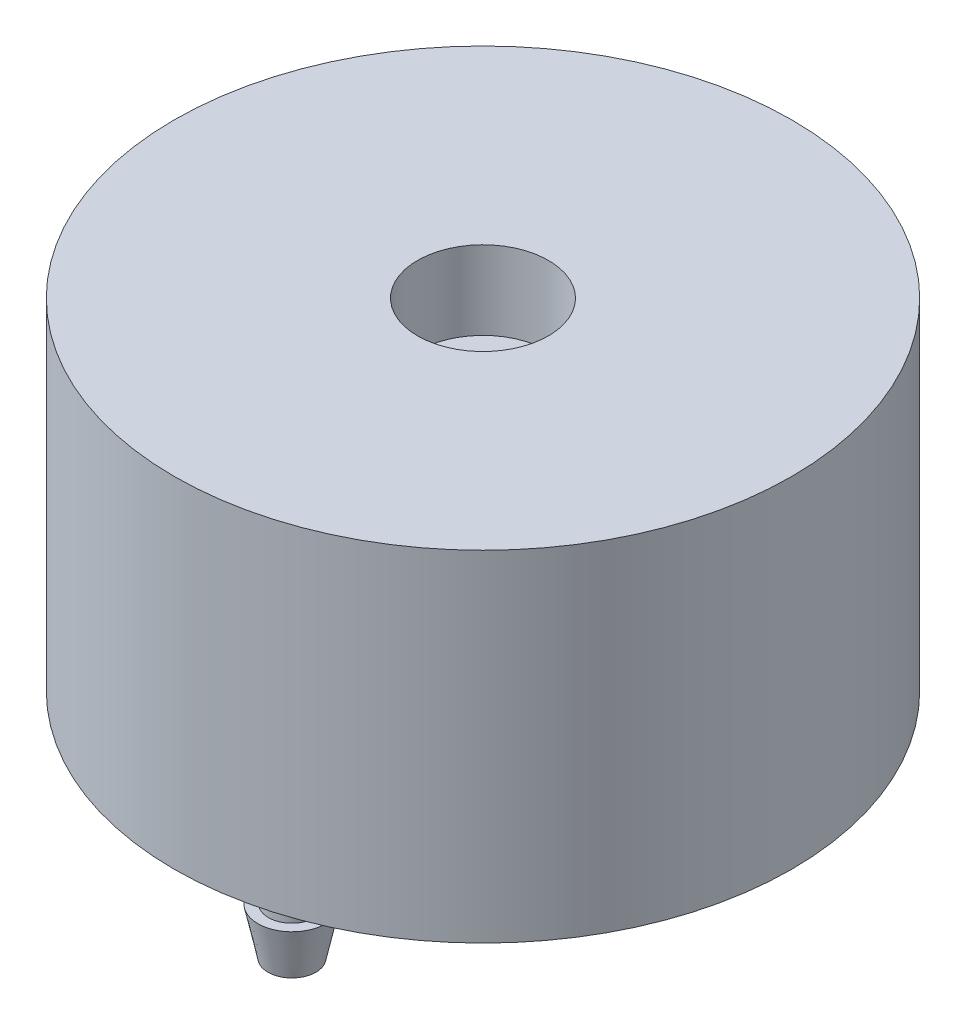
ISO-10303-21;
HEADER;
FILE_DESCRIPTION(('STEP AP214'),'2;1');
FILE_NAME('part.step','',(''),(''),'','','');
FILE_SCHEMA(('AUTOMOTIVE_DESIGN { 1 0 10303 214 1 1 1 1 }'));
ENDSEC;
DATA;
#1=APPLICATION_CONTEXT('core data for automotive mechanical design processes');
#2=APPLICATION_PROTOCOL_DEFINITION('international standard','automotive_design',2000,#1);
#3=PRODUCT_CONTEXT('',#1,'mechanical');
#4=PRODUCT('Part','Part','',(#3));
#5=PRODUCT_RELATED_PRODUCT_CATEGORY('part','',(#4));
#6=PRODUCT_DEFINITION_FORMATION('','',#4);
#7=PRODUCT_DEFINITION_CONTEXT('part definition',#1,'design');
#8=PRODUCT_DEFINITION('design','',#6,#7);
#9=PRODUCT_DEFINITION_SHAPE('','',#8);
#10=(LENGTH_UNIT() NAMED_UNIT(*) SI_UNIT(.MILLI.,.METRE.));
#11=(NAMED_UNIT(*) PLANE_ANGLE_UNIT() SI_UNIT($,.RADIAN.));
#12=(NAMED_UNIT(*) SI_UNIT($,.STERADIAN.) SOLID_ANGLE_UNIT());
#13=UNCERTAINTY_MEASURE_WITH_UNIT(LENGTH_MEASURE(1.E-05),#10,'distance_accuracy_value','');
#14=(GEOMETRIC_REPRESENTATION_CONTEXT(3) GLOBAL_UNCERTAINTY_ASSIGNED_CONTEXT((#13)) GLOBAL_UNIT_ASSIGNED_CONTEXT((#10,
#11,#12)) REPRESENTATION_CONTEXT('',''));
#15=CARTESIAN_POINT('',(0.,0.,0.));
#16=DIRECTION('',(0.,0.,1.));
#17=DIRECTION('',(1.,0.,0.));
#18=AXIS2_PLACEMENT_3D('',#15,#16,#17);
#19=CARTESIAN_POINT('',(0.,0.,0.));
#20=DIRECTION('',(0.,1.,0.));
#21=DIRECTION('',(0.,0.,1.));
#22=AXIS2_PLACEMENT_3D('',#19,#20,#21);
#23=PLANE('',#22);
#24=CARTESIAN_POINT('',(0.,0.,3.65));
#25=DIRECTION('',(0.,1.,0.));
#26=DIRECTION('',(0.,0.,1.));
#27=AXIS2_PLACEMENT_3D('',#24,#25,#26);
#28=CIRCLE('',#27,0.45);
#29=CARTESIAN_POINT('',(0.,0.,4.1));
#30=VERTEX_POINT('',#29);
#31=EDGE_CURVE('E42',#30,#30,#28,.F.);
#32=ORIENTED_EDGE('',*,*,#31,.F.);
#33=EDGE_LOOP('',(#32));
#34=FACE_BOUND('',#33,.T.);
#35=CARTESIAN_POINT('',(0.,0.,0.));
#36=DIRECTION('',(0.,1.,0.));
#37=DIRECTION('',(0.,0.,1.));
#38=AXIS2_PLACEMENT_3D('',#35,#36,#37);
#39=CIRCLE('',#38,5.9);
#40=CARTESIAN_POINT('',(0.,0.,5.9));
#41=VERTEX_POINT('',#40);
#42=EDGE_CURVE('E47',#41,#41,#39,.T.);
#43=ORIENTED_EDGE('',*,*,#42,.F.);
#44=EDGE_LOOP('',(#43));
#45=FACE_BOUND('',#44,.T.);
#46=CARTESIAN_POINT('',(0.,0.,-3.647));
#47=DIRECTION('',(0.,1.,0.));
#48=DIRECTION('',(0.,0.,1.));
#49=AXIS2_PLACEMENT_3D('',#46,#47,#48);
#50=CIRCLE('',#49,0.45);
#51=CARTESIAN_POINT('',(0.,0.,-3.197));
#52=VERTEX_POINT('',#51);
#53=EDGE_CURVE('E10',#52,#52,#50,.F.);
#54=ORIENTED_EDGE('',*,*,#53,.F.);
#55=EDGE_LOOP('',(#54));
#56=FACE_BOUND('',#55,.T.);
#57=ADVANCED_FACE('F34',(#34,#45,#56),#23,.F.);
#58=CARTESIAN_POINT('',(0.,0.5,0.));
#59=DIRECTION('',(0.,1.,0.));
#60=DIRECTION('',(0.,0.,1.));
#61=AXIS2_PLACEMENT_3D('',#58,#59,#60);
#62=PLANE('',#61);
#63=CARTESIAN_POINT('',(0.,0.5,0.));
#64=DIRECTION('',(0.,1.,0.));
#65=DIRECTION('',(0.,0.,1.));
#66=AXIS2_PLACEMENT_3D('',#63,#64,#65);
#67=CIRCLE('',#66,5.4);
#68=CARTESIAN_POINT('',(0.,0.5,5.4));
#69=VERTEX_POINT('',#68);
#70=EDGE_CURVE('E82',#69,#69,#67,.T.);
#71=ORIENTED_EDGE('',*,*,#70,.T.);
#72=EDGE_LOOP('',(#71));
#73=FACE_BOUND('',#72,.T.);
#74=CARTESIAN_POINT('',(0.,0.5,0.));
#75=DIRECTION('',(0.,1.,0.));
#76=DIRECTION('',(0.,0.,1.));
#77=AXIS2_PLACEMENT_3D('',#74,#75,#76);
#78=CIRCLE('',#77,4.5);
#79=CARTESIAN_POINT('',(0.,0.5,4.5));
#80=VERTEX_POINT('',#79);
#81=EDGE_CURVE('E52',#80,#80,#78,.T.);
#82=ORIENTED_EDGE('',*,*,#81,.F.);
#83=EDGE_LOOP('',(#82));
#84=FACE_BOUND('',#83,.T.);
#85=ADVANCED_FACE('F91',(#73,#84),#62,.T.);
#86=CARTESIAN_POINT('',(0.,5.,0.));
#87=DIRECTION('',(0.,-1.,0.));
#88=DIRECTION('',(0.,0.,-1.));
#89=AXIS2_PLACEMENT_3D('',#86,#87,#88);
#90=CYLINDRICAL_SURFACE('',#89,5.9);
#91=ORIENTED_EDGE('',*,*,#42,.T.);
#92=EDGE_LOOP('',(#91));
#93=FACE_BOUND('',#92,.T.);
#94=CARTESIAN_POINT('',(0.,6.5,0.));
#95=DIRECTION('',(0.,1.,0.));
#96=DIRECTION('',(0.,0.,1.));
#97=AXIS2_PLACEMENT_3D('',#94,#95,#96);
#98=CIRCLE('',#97,5.9);
#99=CARTESIAN_POINT('',(0.,6.5,5.9));
#100=VERTEX_POINT('',#99);
#101=EDGE_CURVE('E74',#100,#100,#98,.T.);
#102=ORIENTED_EDGE('',*,*,#101,.F.);
#103=EDGE_LOOP('',(#102));
#104=FACE_BOUND('',#103,.T.);
#105=ADVANCED_FACE('F36',(#93,#104),#90,.T.);
#106=CARTESIAN_POINT('',(0.,6.5,0.));
#107=DIRECTION('',(0.,1.,0.));
#108=DIRECTION('',(0.,0.,1.));
#109=AXIS2_PLACEMENT_3D('',#106,#107,#108);
#110=PLANE('',#109);
#111=ORIENTED_EDGE('',*,*,#101,.T.);
#112=EDGE_LOOP('',(#111));
#113=FACE_BOUND('',#112,.T.);
#114=CARTESIAN_POINT('',(0.,6.5,0.));
#115=DIRECTION('',(0.,1.,0.));
#116=DIRECTION('',(0.,0.,1.));
#117=AXIS2_PLACEMENT_3D('',#114,#115,#116);
#118=CIRCLE('',#117,1.25);
#119=CARTESIAN_POINT('',(0.,6.5,1.25));
#120=VERTEX_POINT('',#119);
#121=EDGE_CURVE('E71',#120,#120,#118,.T.);
#122=ORIENTED_EDGE('',*,*,#121,.F.);
#123=EDGE_LOOP('',(#122));
#124=FACE_BOUND('',#123,.T.);
#125=ADVANCED_FACE('F109',(#113,#124),#110,.T.);
#126=CARTESIAN_POINT('',(0.,5.,0.));
#127=DIRECTION('',(0.,1.,0.));
#128=DIRECTION('',(0.,0.,1.));
#129=AXIS2_PLACEMENT_3D('',#126,#127,#128);
#130=PLANE('',#129);
#131=CARTESIAN_POINT('',(0.,5.,0.));
#132=DIRECTION('',(0.,1.,0.));
#133=DIRECTION('',(0.,0.,1.));
#134=AXIS2_PLACEMENT_3D('',#131,#132,#133);
#135=CIRCLE('',#134,5.4);
#136=CARTESIAN_POINT('',(0.,5.,5.4));
#137=VERTEX_POINT('',#136);
#138=EDGE_CURVE('E79',#137,#137,#135,.T.);
#139=ORIENTED_EDGE('',*,*,#138,.F.);
#140=EDGE_LOOP('',(#139));
#141=FACE_BOUND('',#140,.T.);
#142=CARTESIAN_POINT('',(0.,5.,0.));
#143=DIRECTION('',(0.,1.,0.));
#144=DIRECTION('',(0.,0.,1.));
#145=AXIS2_PLACEMENT_3D('',#142,#143,#144);
#146=CIRCLE('',#145,1.25);
#147=CARTESIAN_POINT('',(0.,5.,1.25));
#148=VERTEX_POINT('',#147);
#149=EDGE_CURVE('E69',#148,#148,#146,.T.);
#150=ORIENTED_EDGE('',*,*,#149,.T.);
#151=EDGE_LOOP('',(#150));
#152=FACE_BOUND('',#151,.T.);
#153=ADVANCED_FACE('F106',(#141,#152),#130,.F.);
#154=CARTESIAN_POINT('',(0.,6.5,0.));
#155=DIRECTION('',(0.,-1.,0.));
#156=DIRECTION('',(0.,0.,-1.));
#157=AXIS2_PLACEMENT_3D('',#154,#155,#156);
#158=CYLINDRICAL_SURFACE('',#157,1.25);
#159=ORIENTED_EDGE('',*,*,#121,.T.);
#160=EDGE_LOOP('',(#159));
#161=FACE_BOUND('',#160,.T.);
#162=ORIENTED_EDGE('',*,*,#149,.F.);
#163=EDGE_LOOP('',(#162));
#164=FACE_BOUND('',#163,.T.);
#165=ADVANCED_FACE('F104',(#161,#164),#158,.F.);
#166=CARTESIAN_POINT('',(0.,5.,0.));
#167=DIRECTION('',(0.,-1.,0.));
#168=DIRECTION('',(0.,0.,-1.));
#169=AXIS2_PLACEMENT_3D('',#166,#167,#168);
#170=CYLINDRICAL_SURFACE('',#169,5.4);
#171=ORIENTED_EDGE('',*,*,#138,.T.);
#172=EDGE_LOOP('',(#171));
#173=FACE_BOUND('',#172,.T.);
#174=ORIENTED_EDGE('',*,*,#70,.F.);
#175=EDGE_LOOP('',(#174));
#176=FACE_BOUND('',#175,.T.);
#177=ADVANCED_FACE('F100',(#173,#176),#170,.F.);
#178=CARTESIAN_POINT('',(0.,4.5,0.));
#179=DIRECTION('',(0.,-1.,0.));
#180=DIRECTION('',(0.,0.,-1.));
#181=AXIS2_PLACEMENT_3D('',#178,#179,#180);
#182=CYLINDRICAL_SURFACE('',#181,4.5);
#183=CARTESIAN_POINT('',(0.,4.5,0.));
#184=DIRECTION('',(0.,1.,0.));
#185=DIRECTION('',(0.,0.,1.));
#186=AXIS2_PLACEMENT_3D('',#183,#184,#185);
#187=CIRCLE('',#186,4.5);
#188=CARTESIAN_POINT('',(0.,4.5,4.5));
#189=VERTEX_POINT('',#188);
#190=EDGE_CURVE('E57',#189,#189,#187,.T.);
#191=ORIENTED_EDGE('',*,*,#190,.F.);
#192=EDGE_LOOP('',(#191));
#193=FACE_BOUND('',#192,.T.);
#194=ORIENTED_EDGE('',*,*,#81,.T.);
#195=EDGE_LOOP('',(#194));
#196=FACE_BOUND('',#195,.T.);
#197=ADVANCED_FACE('F103',(#193,#196),#182,.T.);
#198=CARTESIAN_POINT('',(0.,4.5,0.));
#199=DIRECTION('',(0.,1.,0.));
#200=DIRECTION('',(0.,0.,1.));
#201=AXIS2_PLACEMENT_3D('',#198,#199,#200);
#202=PLANE('',#201);
#203=ORIENTED_EDGE('',*,*,#190,.T.);
#204=EDGE_LOOP('',(#203));
#205=FACE_BOUND('',#204,.T.);
#206=ADVANCED_FACE('F119',(#205),#202,.T.);
#207=CARTESIAN_POINT('',(0.,-2.6,3.65));
#208=DIRECTION('',(0.,1.,0.));
#209=DIRECTION('',(0.,0.,1.));
#210=AXIS2_PLACEMENT_3D('',#207,#208,#209);
#211=CYLINDRICAL_SURFACE('',#210,0.45);
#212=CARTESIAN_POINT('',(0.,-1.7,3.65));
#213=DIRECTION('',(0.,1.,0.));
#214=DIRECTION('',(0.,0.,1.));
#215=AXIS2_PLACEMENT_3D('',#212,#213,#214);
#216=CIRCLE('',#215,0.45);
#217=CARTESIAN_POINT('',(0.,-1.7,4.1));
#218=VERTEX_POINT('',#217);
#219=EDGE_CURVE('E50',#218,#218,#216,.T.);
#220=ORIENTED_EDGE('',*,*,#219,.T.);
#221=EDGE_LOOP('',(#220));
#222=FACE_BOUND('',#221,.T.);
#223=ORIENTED_EDGE('',*,*,#31,.T.);
#224=EDGE_LOOP('',(#223));
#225=FACE_BOUND('',#224,.T.);
#226=ADVANCED_FACE('F123',(#222,#225),#211,.T.);
#227=CARTESIAN_POINT('',(0.,-2.6,-3.647));
#228=DIRECTION('',(0.,1.,0.));
#229=DIRECTION('',(0.,0.,1.));
#230=AXIS2_PLACEMENT_3D('',#227,#228,#229);
#231=CYLINDRICAL_SURFACE('',#230,0.45);
#232=CARTESIAN_POINT('',(0.,-1.7,-3.647));
#233=DIRECTION('',(0.,1.,0.));
#234=DIRECTION('',(0.,0.,1.));
#235=AXIS2_PLACEMENT_3D('',#232,#233,#234);
#236=CIRCLE('',#235,0.45);
#237=CARTESIAN_POINT('',(0.,-1.7,-3.197));
#238=VERTEX_POINT('',#237);
#239=EDGE_CURVE('E38',#238,#238,#236,.T.);
#240=ORIENTED_EDGE('',*,*,#239,.T.);
#241=EDGE_LOOP('',(#240));
#242=FACE_BOUND('',#241,.T.);
#243=ORIENTED_EDGE('',*,*,#53,.T.);
#244=EDGE_LOOP('',(#243));
#245=FACE_BOUND('',#244,.T.);
#246=ADVANCED_FACE('F127',(#242,#245),#231,.T.);
#247=CARTESIAN_POINT('',(0.,-1.7,3.65));
#248=DIRECTION('',(0.,1.,0.));
#249=DIRECTION('',(0.,0.,1.));
#250=AXIS2_PLACEMENT_3D('',#247,#248,#249);
#251=PLANE('',#250);
#252=CARTESIAN_POINT('',(0.,-1.7,3.65));
#253=DIRECTION('',(0.,1.,0.));
#254=DIRECTION('',(0.,0.,1.));
#255=AXIS2_PLACEMENT_3D('',#252,#253,#254);
#256=CIRCLE('',#255,0.65);
#257=CARTESIAN_POINT('',(0.,-1.7,4.3));
#258=VERTEX_POINT('',#257);
#259=EDGE_CURVE('E60',#258,#258,#256,.T.);
#260=ORIENTED_EDGE('',*,*,#259,.T.);
#261=EDGE_LOOP('',(#260));
#262=FACE_BOUND('',#261,.T.);
#263=ORIENTED_EDGE('',*,*,#219,.F.);
#264=EDGE_LOOP('',(#263));
#265=FACE_BOUND('',#264,.T.);
#266=ADVANCED_FACE('F136',(#262,#265),#251,.T.);
#267=CARTESIAN_POINT('',(0.,-1.7,3.65));
#268=DIRECTION('',(0.,1.,0.));
#269=DIRECTION('',(0.,0.,1.));
#270=AXIS2_PLACEMENT_3D('',#267,#268,#269);
#271=CONICAL_SURFACE('',#270,0.65,0.20943951023932);
#272=CARTESIAN_POINT('',(0.,-2.6,3.65));
#273=DIRECTION('',(0.,1.,0.));
#274=DIRECTION('',(0.,0.,1.));
#275=AXIS2_PLACEMENT_3D('',#272,#273,#274);
#276=CIRCLE('',#275,0.45869909449698);
#277=CARTESIAN_POINT('',(0.,-2.6,4.10869909449698));
#278=VERTEX_POINT('',#277);
#279=EDGE_CURVE('E53',#278,#278,#276,.T.);
#280=ORIENTED_EDGE('',*,*,#279,.T.);
#281=EDGE_LOOP('',(#280));
#282=FACE_BOUND('',#281,.T.);
#283=ORIENTED_EDGE('',*,*,#259,.F.);
#284=EDGE_LOOP('',(#283));
#285=FACE_BOUND('',#284,.T.);
#286=ADVANCED_FACE('F132',(#282,#285),#271,.T.);
#287=CARTESIAN_POINT('',(0.,-2.6,3.65));
#288=DIRECTION('',(0.,-1.,0.));
#289=DIRECTION('',(0.,0.,-1.));
#290=AXIS2_PLACEMENT_3D('',#287,#288,#289);
#291=PLANE('',#290);
#292=ORIENTED_EDGE('',*,*,#279,.F.);
#293=EDGE_LOOP('',(#292));
#294=FACE_BOUND('',#293,.T.);
#295=ADVANCED_FACE('F128',(#294),#291,.T.);
#296=CARTESIAN_POINT('',(0.,-1.7,-3.647));
#297=DIRECTION('',(0.,1.,0.));
#298=DIRECTION('',(0.,0.,1.));
#299=AXIS2_PLACEMENT_3D('',#296,#297,#298);
#300=PLANE('',#299);
#301=CARTESIAN_POINT('',(0.,-1.7,-3.647));
#302=DIRECTION('',(0.,1.,0.));
#303=DIRECTION('',(0.,0.,1.));
#304=AXIS2_PLACEMENT_3D('',#301,#302,#303);
#305=CIRCLE('',#304,0.65);
#306=CARTESIAN_POINT('',(0.,-1.7,-2.997));
#307=VERTEX_POINT('',#306);
#308=EDGE_CURVE('E158',#307,#307,#305,.T.);
#309=ORIENTED_EDGE('',*,*,#308,.T.);
#310=EDGE_LOOP('',(#309));
#311=FACE_BOUND('',#310,.T.);
#312=ORIENTED_EDGE('',*,*,#239,.F.);
#313=EDGE_LOOP('',(#312));
#314=FACE_BOUND('',#313,.T.);
#315=ADVANCED_FACE('F131',(#311,#314),#300,.T.);
#316=CARTESIAN_POINT('',(0.,-1.7,-3.647));
#317=DIRECTION('',(0.,1.,0.));
#318=DIRECTION('',(0.,0.,1.));
#319=AXIS2_PLACEMENT_3D('',#316,#317,#318);
#320=CONICAL_SURFACE('',#319,0.65,0.20943951023932);
#321=CARTESIAN_POINT('',(0.,-2.6,-3.647));
#322=DIRECTION('',(0.,1.,0.));
#323=DIRECTION('',(0.,0.,1.));
#324=AXIS2_PLACEMENT_3D('',#321,#322,#323);
#325=CIRCLE('',#324,0.45869909449698);
#326=CARTESIAN_POINT('',(0.,-2.6,-3.18830090550302));
#327=VERTEX_POINT('',#326);
#328=EDGE_CURVE('E161',#327,#327,#325,.T.);
#329=ORIENTED_EDGE('',*,*,#328,.T.);
#330=EDGE_LOOP('',(#329));
#331=FACE_BOUND('',#330,.T.);
#332=ORIENTED_EDGE('',*,*,#308,.F.);
#333=EDGE_LOOP('',(#332));
#334=FACE_BOUND('',#333,.T.);
#335=ADVANCED_FACE('F141',(#331,#334),#320,.T.);
#336=CARTESIAN_POINT('',(0.,-2.6,-3.647));
#337=DIRECTION('',(0.,-1.,0.));
#338=DIRECTION('',(0.,0.,-1.));
#339=AXIS2_PLACEMENT_3D('',#336,#337,#338);
#340=PLANE('',#339);
#341=ORIENTED_EDGE('',*,*,#328,.F.);
#342=EDGE_LOOP('',(#341));
#343=FACE_BOUND('',#342,.T.);
#344=ADVANCED_FACE('F138',(#343),#340,.T.);
#345=CLOSED_SHELL('',(#57,#85,#105,#125,#153,#165,#177,#197,#206,#226,#246,#266,#286,#295,#315,
#335,#344));
#346=MANIFOLD_SOLID_BREP('B2',#345);
#347=ADVANCED_BREP_SHAPE_REPRESENTATION('',(#18,#346),#14);
#348=SHAPE_DEFINITION_REPRESENTATION(#9,#347);
ENDSEC;
END-ISO-10303-21;
